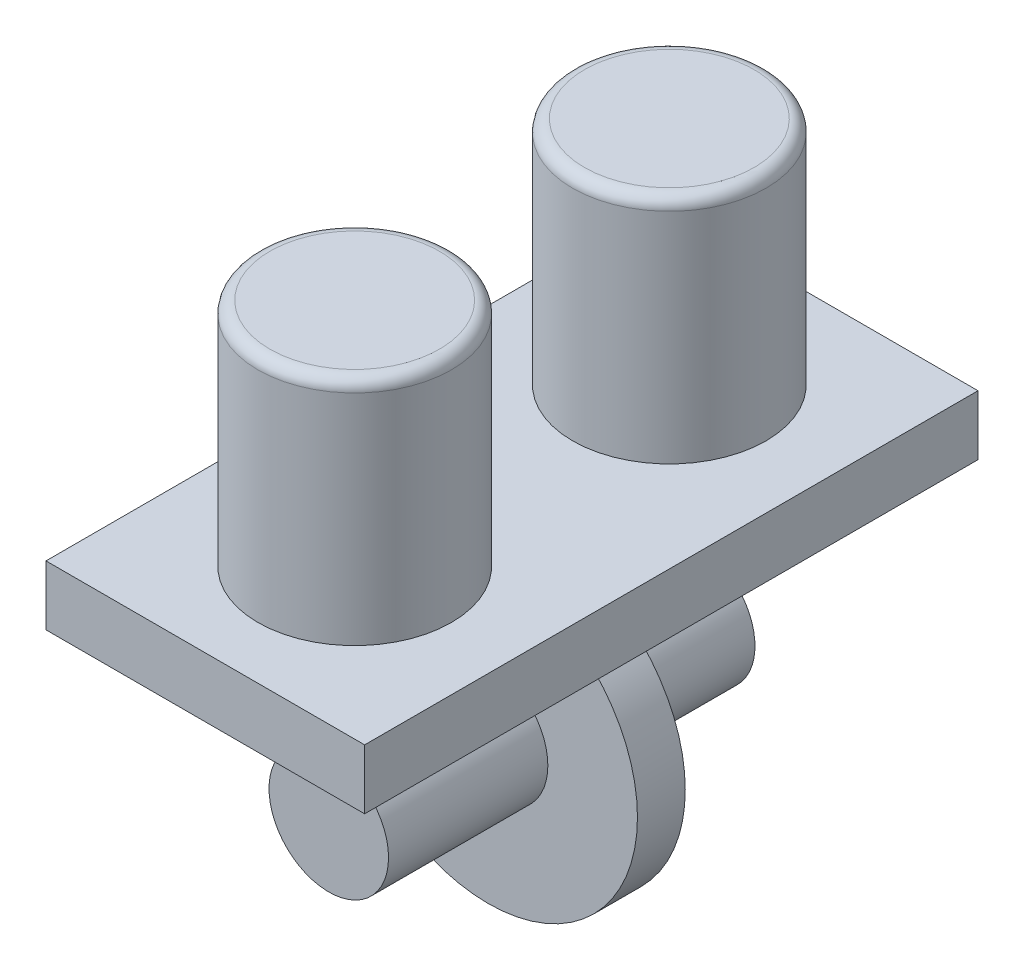
ISO-10303-21;
HEADER;
FILE_DESCRIPTION(('STEP AP214'),'2;1');
FILE_NAME('part.step','',(''),(''),'','','');
FILE_SCHEMA(('AUTOMOTIVE_DESIGN { 1 0 10303 214 1 1 1 1 }'));
ENDSEC;
DATA;
#1=APPLICATION_CONTEXT('core data for automotive mechanical design processes');
#2=APPLICATION_PROTOCOL_DEFINITION('international standard','automotive_design',2000,#1);
#3=PRODUCT_CONTEXT('',#1,'mechanical');
#4=PRODUCT('Part','Part','',(#3));
#5=PRODUCT_RELATED_PRODUCT_CATEGORY('part','',(#4));
#6=PRODUCT_DEFINITION_FORMATION('','',#4);
#7=PRODUCT_DEFINITION_CONTEXT('part definition',#1,'design');
#8=PRODUCT_DEFINITION('design','',#6,#7);
#9=PRODUCT_DEFINITION_SHAPE('','',#8);
#10=(LENGTH_UNIT() NAMED_UNIT(*) SI_UNIT(.MILLI.,.METRE.));
#11=(NAMED_UNIT(*) PLANE_ANGLE_UNIT() SI_UNIT($,.RADIAN.));
#12=(NAMED_UNIT(*) SI_UNIT($,.STERADIAN.) SOLID_ANGLE_UNIT());
#13=UNCERTAINTY_MEASURE_WITH_UNIT(LENGTH_MEASURE(1.E-05),#10,'distance_accuracy_value','');
#14=(GEOMETRIC_REPRESENTATION_CONTEXT(3) GLOBAL_UNCERTAINTY_ASSIGNED_CONTEXT((#13)) GLOBAL_UNIT_ASSIGNED_CONTEXT((#10,
#11,#12)) REPRESENTATION_CONTEXT('',''));
#15=CARTESIAN_POINT('',(0.,0.,0.));
#16=DIRECTION('',(0.,0.,1.));
#17=DIRECTION('',(1.,0.,0.));
#18=AXIS2_PLACEMENT_3D('',#15,#16,#17);
#19=CARTESIAN_POINT('',(0.,0.,30.48));
#20=DIRECTION('',(0.,0.,-1.));
#21=DIRECTION('',(-1.,0.,0.));
#22=AXIS2_PLACEMENT_3D('',#19,#20,#21);
#23=CYLINDRICAL_SURFACE('',#22,95.25);
#24=CARTESIAN_POINT('',(0.,0.,0.));
#25=DIRECTION('',(0.,0.,1.));
#26=DIRECTION('',(1.,0.,0.));
#27=AXIS2_PLACEMENT_3D('',#24,#25,#26);
#28=CIRCLE('',#27,95.25);
#29=CARTESIAN_POINT('',(-95.25,0.,0.));
#30=VERTEX_POINT('',#29);
#31=EDGE_CURVE('E56',#30,#30,#28,.T.);
#32=CARTESIAN_POINT('',(0.,0.,30.48));
#33=DIRECTION('',(0.,0.,1.));
#34=DIRECTION('',(1.,0.,0.));
#35=AXIS2_PLACEMENT_3D('',#32,#33,#34);
#36=CIRCLE('',#35,95.25);
#37=CARTESIAN_POINT('',(-95.25,0.,30.48));
#38=VERTEX_POINT('',#37);
#39=EDGE_CURVE('E47',#38,#38,#36,.T.);
#40=CARTESIAN_POINT('',(-95.25,0.,0.));
#41=CARTESIAN_POINT('',(-95.25,0.,0.317499999999999));
#42=CARTESIAN_POINT('',(-95.25,0.,0.634999999999999));
#43=CARTESIAN_POINT('',(-95.25,0.,1.27));
#44=CARTESIAN_POINT('',(-95.25,0.,1.5875));
#45=CARTESIAN_POINT('',(-95.25,0.,2.2225));
#46=CARTESIAN_POINT('',(-95.25,0.,2.54));
#47=CARTESIAN_POINT('',(-95.25,0.,3.175));
#48=CARTESIAN_POINT('',(-95.25,0.,3.4925));
#49=CARTESIAN_POINT('',(-95.25,0.,4.1275));
#50=CARTESIAN_POINT('',(-95.25,0.,4.445));
#51=CARTESIAN_POINT('',(-95.25,0.,5.08));
#52=CARTESIAN_POINT('',(-95.25,0.,5.3975));
#53=CARTESIAN_POINT('',(-95.25,0.,6.0325));
#54=CARTESIAN_POINT('',(-95.25,0.,6.35));
#55=CARTESIAN_POINT('',(-95.25,0.,6.985));
#56=CARTESIAN_POINT('',(-95.25,0.,7.3025));
#57=CARTESIAN_POINT('',(-95.25,0.,7.9375));
#58=CARTESIAN_POINT('',(-95.25,0.,8.255));
#59=CARTESIAN_POINT('',(-95.25,0.,8.89));
#60=CARTESIAN_POINT('',(-95.25,0.,9.2075));
#61=CARTESIAN_POINT('',(-95.25,0.,9.8425));
#62=CARTESIAN_POINT('',(-95.25,0.,10.16));
#63=CARTESIAN_POINT('',(-95.25,0.,10.795));
#64=CARTESIAN_POINT('',(-95.25,0.,11.1125));
#65=CARTESIAN_POINT('',(-95.25,0.,11.7475));
#66=CARTESIAN_POINT('',(-95.25,0.,12.065));
#67=CARTESIAN_POINT('',(-95.25,0.,12.7));
#68=CARTESIAN_POINT('',(-95.25,0.,13.0175));
#69=CARTESIAN_POINT('',(-95.25,0.,13.6525));
#70=CARTESIAN_POINT('',(-95.25,0.,13.97));
#71=CARTESIAN_POINT('',(-95.25,0.,14.605));
#72=CARTESIAN_POINT('',(-95.25,0.,14.9225));
#73=CARTESIAN_POINT('',(-95.25,0.,15.5575));
#74=CARTESIAN_POINT('',(-95.25,0.,15.875));
#75=CARTESIAN_POINT('',(-95.25,0.,16.51));
#76=CARTESIAN_POINT('',(-95.25,0.,16.8275));
#77=CARTESIAN_POINT('',(-95.25,0.,17.4625));
#78=CARTESIAN_POINT('',(-95.25,0.,17.78));
#79=CARTESIAN_POINT('',(-95.25,0.,18.415));
#80=CARTESIAN_POINT('',(-95.25,0.,18.7325));
#81=CARTESIAN_POINT('',(-95.25,0.,19.3675));
#82=CARTESIAN_POINT('',(-95.25,0.,19.685));
#83=CARTESIAN_POINT('',(-95.25,0.,20.32));
#84=CARTESIAN_POINT('',(-95.25,0.,20.6375));
#85=CARTESIAN_POINT('',(-95.25,0.,21.2725));
#86=CARTESIAN_POINT('',(-95.25,0.,21.59));
#87=CARTESIAN_POINT('',(-95.25,0.,22.225));
#88=CARTESIAN_POINT('',(-95.25,0.,22.5425));
#89=CARTESIAN_POINT('',(-95.25,0.,23.1775));
#90=CARTESIAN_POINT('',(-95.25,0.,23.495));
#91=CARTESIAN_POINT('',(-95.25,0.,24.13));
#92=CARTESIAN_POINT('',(-95.25,0.,24.4475));
#93=CARTESIAN_POINT('',(-95.25,0.,25.0825));
#94=CARTESIAN_POINT('',(-95.25,0.,25.4));
#95=CARTESIAN_POINT('',(-95.25,0.,26.035));
#96=CARTESIAN_POINT('',(-95.25,0.,26.3525));
#97=CARTESIAN_POINT('',(-95.25,0.,26.9875));
#98=CARTESIAN_POINT('',(-95.25,0.,27.305));
#99=CARTESIAN_POINT('',(-95.25,0.,27.94));
#100=CARTESIAN_POINT('',(-95.25,0.,28.2575));
#101=CARTESIAN_POINT('',(-95.25,0.,28.8925));
#102=CARTESIAN_POINT('',(-95.25,0.,29.21));
#103=CARTESIAN_POINT('',(-95.25,0.,29.845));
#104=CARTESIAN_POINT('',(-95.25,0.,30.1625));
#105=CARTESIAN_POINT('',(-95.25,0.,30.48));
#106=B_SPLINE_CURVE_WITH_KNOTS('',3,(#40,#41,#42,#43,#44,#45,#46,#47,#48,#49,#50,#51,#52,#53,
#54,#55,#56,#57,#58,#59,#60,#61,#62,#63,#64,#65,#66,#67,#68,#69,#70,#71,#72,#73,#74,#75,#76,#77,
#78,#79,#80,#81,#82,#83,#84,#85,#86,#87,#88,#89,#90,#91,#92,#93,#94,#95,#96,#97,#98,#99,#100,
#101,#102,#103,#104,#105),.UNSPECIFIED.,.F.,.F.,(4,2,2,2,2,2,2,2,2,2,2,2,2,2,2,2,2,2,2,2,2,2,2,
2,2,2,2,2,2,2,2,2,4),(0.,0.952499999999998,1.905,2.8575,3.81,4.7625,5.715,6.6675,7.62,8.5725,
9.525,10.4775,11.43,12.3825,13.335,14.2875,15.24,16.1925,17.145,18.0975,19.05,20.0025,20.955,
21.9075,22.86,23.8125,24.765,25.7175,26.67,27.6225,28.575,29.5275,30.48),.UNSPECIFIED.);
#107=EDGE_CURVE('BSEAM43',#30,#38,#106,.T.);
#108=ORIENTED_EDGE('',*,*,#31,.T.);
#109=ORIENTED_EDGE('',*,*,#39,.F.);
#110=ORIENTED_EDGE('',*,*,#107,.T.);
#111=ORIENTED_EDGE('',*,*,#107,.F.);
#112=EDGE_LOOP('',(#108,#110,#109,#111));
#113=FACE_BOUND('',#112,.T.);
#114=ADVANCED_FACE('F43',(#113),#23,.T.);
#115=CARTESIAN_POINT('',(0.,0.,30.48));
#116=DIRECTION('',(0.,0.,1.));
#117=DIRECTION('',(1.,0.,0.));
#118=AXIS2_PLACEMENT_3D('',#115,#116,#117);
#119=PLANE('',#118);
#120=CARTESIAN_POINT('',(0.,0.,30.48));
#121=DIRECTION('',(0.,0.,1.));
#122=DIRECTION('',(1.,0.,0.));
#123=AXIS2_PLACEMENT_3D('',#120,#121,#122);
#124=CIRCLE('',#123,38.1);
#125=CARTESIAN_POINT('',(38.1,0.,30.48));
#126=VERTEX_POINT('',#125);
#127=EDGE_CURVE('E51',#126,#126,#124,.T.);
#128=ORIENTED_EDGE('',*,*,#127,.F.);
#129=EDGE_LOOP('',(#128));
#130=FACE_BOUND('',#129,.T.);
#131=ORIENTED_EDGE('',*,*,#39,.T.);
#132=EDGE_LOOP('',(#131));
#133=FACE_BOUND('',#132,.T.);
#134=ADVANCED_FACE('F45',(#130,#133),#119,.T.);
#135=CARTESIAN_POINT('',(0.,0.,0.));
#136=DIRECTION('',(0.,0.,1.));
#137=DIRECTION('',(1.,0.,0.));
#138=AXIS2_PLACEMENT_3D('',#135,#136,#137);
#139=PLANE('',#138);
#140=CARTESIAN_POINT('',(0.,0.,0.));
#141=DIRECTION('',(0.,0.,-1.));
#142=DIRECTION('',(-1.,0.,0.));
#143=AXIS2_PLACEMENT_3D('',#140,#141,#142);
#144=CIRCLE('',#143,38.1);
#145=CARTESIAN_POINT('',(-38.1,0.,0.));
#146=VERTEX_POINT('',#145);
#147=EDGE_CURVE('E11',#146,#146,#144,.T.);
#148=ORIENTED_EDGE('',*,*,#147,.F.);
#149=EDGE_LOOP('',(#148));
#150=FACE_BOUND('',#149,.T.);
#151=ORIENTED_EDGE('',*,*,#31,.F.);
#152=EDGE_LOOP('',(#151));
#153=FACE_BOUND('',#152,.T.);
#154=ADVANCED_FACE('F75',(#150,#153),#139,.F.);
#155=CARTESIAN_POINT('',(0.,0.,132.08));
#156=DIRECTION('',(0.,0.,-1.));
#157=DIRECTION('',(-1.,0.,0.));
#158=AXIS2_PLACEMENT_3D('',#155,#156,#157);
#159=CYLINDRICAL_SURFACE('',#158,38.1);
#160=CARTESIAN_POINT('',(0.,0.,132.08));
#161=DIRECTION('',(0.,0.,1.));
#162=DIRECTION('',(1.,0.,0.));
#163=AXIS2_PLACEMENT_3D('',#160,#161,#162);
#164=CIRCLE('',#163,38.1);
#165=CARTESIAN_POINT('',(38.1,0.,132.08));
#166=VERTEX_POINT('',#165);
#167=EDGE_CURVE('E61',#166,#166,#164,.T.);
#168=ORIENTED_EDGE('',*,*,#167,.F.);
#169=EDGE_LOOP('',(#168));
#170=FACE_BOUND('',#169,.T.);
#171=ORIENTED_EDGE('',*,*,#127,.T.);
#172=EDGE_LOOP('',(#171));
#173=FACE_BOUND('',#172,.T.);
#174=ADVANCED_FACE('F78',(#170,#173),#159,.T.);
#175=CARTESIAN_POINT('',(0.,0.,132.08));
#176=DIRECTION('',(0.,0.,1.));
#177=DIRECTION('',(1.,0.,0.));
#178=AXIS2_PLACEMENT_3D('',#175,#176,#177);
#179=PLANE('',#178);
#180=ORIENTED_EDGE('',*,*,#167,.T.);
#181=EDGE_LOOP('',(#180));
#182=FACE_BOUND('',#181,.T.);
#183=ADVANCED_FACE('F85',(#182),#179,.T.);
#184=CARTESIAN_POINT('',(0.,0.,-101.6));
#185=DIRECTION('',(0.,0.,1.));
#186=DIRECTION('',(1.,0.,0.));
#187=AXIS2_PLACEMENT_3D('',#184,#185,#186);
#188=CYLINDRICAL_SURFACE('',#187,38.1);
#189=CARTESIAN_POINT('',(0.,0.,-101.6));
#190=DIRECTION('',(0.,0.,-1.));
#191=DIRECTION('',(-1.,0.,0.));
#192=AXIS2_PLACEMENT_3D('',#189,#190,#191);
#193=CIRCLE('',#192,38.1);
#194=CARTESIAN_POINT('',(-38.1,0.,-101.6));
#195=VERTEX_POINT('',#194);
#196=EDGE_CURVE('E60',#195,#195,#193,.T.);
#197=ORIENTED_EDGE('',*,*,#196,.F.);
#198=EDGE_LOOP('',(#197));
#199=FACE_BOUND('',#198,.T.);
#200=ORIENTED_EDGE('',*,*,#147,.T.);
#201=EDGE_LOOP('',(#200));
#202=FACE_BOUND('',#201,.T.);
#203=ADVANCED_FACE('F91',(#199,#202),#188,.T.);
#204=CARTESIAN_POINT('',(0.,0.,-101.6));
#205=DIRECTION('',(0.,0.,-1.));
#206=DIRECTION('',(-1.,0.,0.));
#207=AXIS2_PLACEMENT_3D('',#204,#205,#206);
#208=PLANE('',#207);
#209=ORIENTED_EDGE('',*,*,#196,.T.);
#210=EDGE_LOOP('',(#209));
#211=FACE_BOUND('',#210,.T.);
#212=ADVANCED_FACE('F99',(#211),#208,.T.);
#213=CLOSED_SHELL('',(#114,#134,#154,#174,#183,#203,#212));
#214=MANIFOLD_SOLID_BREP('B2',#213);
#215=CARTESIAN_POINT('',(-101.6,95.25,30.48));
#216=DIRECTION('',(0.,1.,0.));
#217=DIRECTION('',(0.,0.,1.));
#218=AXIS2_PLACEMENT_3D('',#215,#216,#217);
#219=PLANE('',#218);
#220=DIRECTION('',(0.,0.,-1.));
#221=VECTOR('',#220,1.);
#222=CARTESIAN_POINT('',(101.6,95.25,30.48));
#223=LINE('',#222,#221);
#224=CARTESIAN_POINT('',(101.6,95.25,210.82));
#225=VERTEX_POINT('',#224);
#226=CARTESIAN_POINT('',(101.6,95.25,-180.34));
#227=VERTEX_POINT('',#226);
#228=EDGE_CURVE('E197',#225,#227,#223,.T.);
#229=ORIENTED_EDGE('',*,*,#228,.F.);
#230=DIRECTION('',(1.,0.,0.));
#231=VECTOR('',#230,1.);
#232=CARTESIAN_POINT('',(-101.6,95.25,210.82));
#233=LINE('',#232,#231);
#234=CARTESIAN_POINT('',(-101.6,95.25,210.82));
#235=VERTEX_POINT('',#234);
#236=EDGE_CURVE('E196',#235,#225,#233,.T.);
#237=ORIENTED_EDGE('',*,*,#236,.F.);
#238=DIRECTION('',(0.,0.,-1.));
#239=VECTOR('',#238,1.);
#240=CARTESIAN_POINT('',(-101.6,95.25,30.48));
#241=LINE('',#240,#239);
#242=CARTESIAN_POINT('',(-101.6,95.25,-180.34));
#243=VERTEX_POINT('',#242);
#244=EDGE_CURVE('E184',#235,#243,#241,.T.);
#245=ORIENTED_EDGE('',*,*,#244,.T.);
#246=DIRECTION('',(-1.,0.,0.));
#247=VECTOR('',#246,1.);
#248=CARTESIAN_POINT('',(101.6,95.25,-180.34));
#249=LINE('',#248,#247);
#250=EDGE_CURVE('E218',#227,#243,#249,.T.);
#251=ORIENTED_EDGE('',*,*,#250,.F.);
#252=EDGE_LOOP('',(#229,#237,#245,#251));
#253=FACE_BOUND('',#252,.T.);
#254=ADVANCED_FACE('F144',(#253),#219,.F.);
#255=CARTESIAN_POINT('',(101.6,133.35,30.48));
#256=DIRECTION('',(1.,0.,0.));
#257=DIRECTION('',(0.,0.,-1.));
#258=AXIS2_PLACEMENT_3D('',#255,#256,#257);
#259=PLANE('',#258);
#260=ORIENTED_EDGE('',*,*,#228,.T.);
#261=DIRECTION('',(0.,-1.,0.));
#262=VECTOR('',#261,1.);
#263=CARTESIAN_POINT('',(101.6,133.35,-180.34));
#264=LINE('',#263,#262);
#265=CARTESIAN_POINT('',(101.6,133.35,-180.34));
#266=VERTEX_POINT('',#265);
#267=EDGE_CURVE('E215',#266,#227,#264,.T.);
#268=ORIENTED_EDGE('',*,*,#267,.F.);
#269=DIRECTION('',(0.,0.,-1.));
#270=VECTOR('',#269,1.);
#271=CARTESIAN_POINT('',(101.6,133.35,30.48));
#272=LINE('',#271,#270);
#273=CARTESIAN_POINT('',(101.6,133.35,210.82));
#274=VERTEX_POINT('',#273);
#275=EDGE_CURVE('E159',#274,#266,#272,.T.);
#276=ORIENTED_EDGE('',*,*,#275,.F.);
#277=DIRECTION('',(0.,1.,0.));
#278=VECTOR('',#277,1.);
#279=CARTESIAN_POINT('',(101.6,133.35,210.82));
#280=LINE('',#279,#278);
#281=EDGE_CURVE('E201',#225,#274,#280,.T.);
#282=ORIENTED_EDGE('',*,*,#281,.F.);
#283=EDGE_LOOP('',(#260,#268,#276,#282));
#284=FACE_BOUND('',#283,.T.);
#285=ADVANCED_FACE('F253',(#284),#259,.T.);
#286=CARTESIAN_POINT('',(-101.6,133.35,30.48));
#287=DIRECTION('',(0.,1.,0.));
#288=DIRECTION('',(0.,0.,1.));
#289=AXIS2_PLACEMENT_3D('',#286,#287,#288);
#290=PLANE('',#289);
#291=CARTESIAN_POINT('',(-7.00600645452263E-13,133.35,-85.09));
#292=DIRECTION('',(0.,1.,0.));
#293=DIRECTION('',(0.,0.,1.));
#294=AXIS2_PLACEMENT_3D('',#291,#292,#293);
#295=CIRCLE('',#294,61.722);
#296=CARTESIAN_POINT('',(-7.00600645452263E-13,133.35,-23.368));
#297=VERTEX_POINT('',#296);
#298=EDGE_CURVE('E209',#297,#297,#295,.T.);
#299=ORIENTED_EDGE('',*,*,#298,.F.);
#300=EDGE_LOOP('',(#299));
#301=FACE_BOUND('',#300,.T.);
#302=CARTESIAN_POINT('',(0.,133.35,115.57));
#303=DIRECTION('',(0.,1.,0.));
#304=DIRECTION('',(0.,0.,1.));
#305=AXIS2_PLACEMENT_3D('',#302,#303,#304);
#306=CIRCLE('',#305,61.722);
#307=CARTESIAN_POINT('',(0.,133.35,177.292));
#308=VERTEX_POINT('',#307);
#309=EDGE_CURVE('E206',#308,#308,#306,.T.);
#310=ORIENTED_EDGE('',*,*,#309,.F.);
#311=EDGE_LOOP('',(#310));
#312=FACE_BOUND('',#311,.T.);
#313=ORIENTED_EDGE('',*,*,#275,.T.);
#314=DIRECTION('',(1.,0.,0.));
#315=VECTOR('',#314,1.);
#316=CARTESIAN_POINT('',(101.6,133.35,-180.34));
#317=LINE('',#316,#315);
#318=CARTESIAN_POINT('',(-101.6,133.35,-180.34));
#319=VERTEX_POINT('',#318);
#320=EDGE_CURVE('E193',#319,#266,#317,.T.);
#321=ORIENTED_EDGE('',*,*,#320,.F.);
#322=DIRECTION('',(0.,0.,-1.));
#323=VECTOR('',#322,1.);
#324=CARTESIAN_POINT('',(-101.6,133.35,30.48));
#325=LINE('',#324,#323);
#326=CARTESIAN_POINT('',(-101.6,133.35,210.82));
#327=VERTEX_POINT('',#326);
#328=EDGE_CURVE('E167',#327,#319,#325,.T.);
#329=ORIENTED_EDGE('',*,*,#328,.F.);
#330=DIRECTION('',(-1.,0.,0.));
#331=VECTOR('',#330,1.);
#332=CARTESIAN_POINT('',(-101.6,133.35,210.82));
#333=LINE('',#332,#331);
#334=EDGE_CURVE('E205',#274,#327,#333,.T.);
#335=ORIENTED_EDGE('',*,*,#334,.F.);
#336=EDGE_LOOP('',(#313,#321,#329,#335));
#337=FACE_BOUND('',#336,.T.);
#338=ADVANCED_FACE('F245',(#301,#312,#337),#290,.T.);
#339=CARTESIAN_POINT('',(-101.6,133.35,30.48));
#340=DIRECTION('',(1.,0.,0.));
#341=DIRECTION('',(0.,0.,-1.));
#342=AXIS2_PLACEMENT_3D('',#339,#340,#341);
#343=PLANE('',#342);
#344=ORIENTED_EDGE('',*,*,#328,.T.);
#345=DIRECTION('',(0.,1.,0.));
#346=VECTOR('',#345,1.);
#347=CARTESIAN_POINT('',(-101.6,133.35,-180.34));
#348=LINE('',#347,#346);
#349=EDGE_CURVE('E189',#243,#319,#348,.T.);
#350=ORIENTED_EDGE('',*,*,#349,.F.);
#351=ORIENTED_EDGE('',*,*,#244,.F.);
#352=DIRECTION('',(0.,-1.,0.));
#353=VECTOR('',#352,1.);
#354=CARTESIAN_POINT('',(-101.6,133.35,210.82));
#355=LINE('',#354,#353);
#356=EDGE_CURVE('E188',#327,#235,#355,.T.);
#357=ORIENTED_EDGE('',*,*,#356,.F.);
#358=EDGE_LOOP('',(#344,#350,#351,#357));
#359=FACE_BOUND('',#358,.T.);
#360=ADVANCED_FACE('F186',(#359),#343,.F.);
#361=CARTESIAN_POINT('',(0.,0.,-180.34));
#362=DIRECTION('',(0.,0.,-1.));
#363=DIRECTION('',(-1.,0.,0.));
#364=AXIS2_PLACEMENT_3D('',#361,#362,#363);
#365=PLANE('',#364);
#366=ORIENTED_EDGE('',*,*,#267,.T.);
#367=ORIENTED_EDGE('',*,*,#250,.T.);
#368=ORIENTED_EDGE('',*,*,#349,.T.);
#369=ORIENTED_EDGE('',*,*,#320,.T.);
#370=EDGE_LOOP('',(#366,#367,#368,#369));
#371=FACE_BOUND('',#370,.T.);
#372=ADVANCED_FACE('F244',(#371),#365,.T.);
#373=CARTESIAN_POINT('',(0.,0.,210.82));
#374=DIRECTION('',(0.,0.,1.));
#375=DIRECTION('',(1.,0.,0.));
#376=AXIS2_PLACEMENT_3D('',#373,#374,#375);
#377=PLANE('',#376);
#378=ORIENTED_EDGE('',*,*,#356,.T.);
#379=ORIENTED_EDGE('',*,*,#236,.T.);
#380=ORIENTED_EDGE('',*,*,#281,.T.);
#381=ORIENTED_EDGE('',*,*,#334,.T.);
#382=EDGE_LOOP('',(#378,#379,#380,#381));
#383=FACE_BOUND('',#382,.T.);
#384=ADVANCED_FACE('F204',(#383),#377,.T.);
#385=CARTESIAN_POINT('',(0.,280.4922,115.57));
#386=DIRECTION('',(0.,-1.,0.));
#387=DIRECTION('',(0.,0.,-1.));
#388=AXIS2_PLACEMENT_3D('',#385,#386,#387);
#389=CYLINDRICAL_SURFACE('',#388,61.722);
#390=CARTESIAN_POINT('',(0.,272.8722,115.57));
#391=DIRECTION('',(0.,1.,0.));
#392=DIRECTION('',(0.,0.,1.));
#393=AXIS2_PLACEMENT_3D('',#390,#391,#392);
#394=CIRCLE('',#393,61.722);
#395=CARTESIAN_POINT('',(0.,272.8722,177.292));
#396=VERTEX_POINT('',#395);
#397=EDGE_CURVE('E228',#396,#396,#394,.F.);
#398=ORIENTED_EDGE('',*,*,#397,.T.);
#399=EDGE_LOOP('',(#398));
#400=FACE_BOUND('',#399,.T.);
#401=ORIENTED_EDGE('',*,*,#309,.T.);
#402=EDGE_LOOP('',(#401));
#403=FACE_BOUND('',#402,.T.);
#404=ADVANCED_FACE('F284',(#400,#403),#389,.T.);
#405=CARTESIAN_POINT('',(0.,280.4922,115.57));
#406=DIRECTION('',(0.,1.,0.));
#407=DIRECTION('',(0.,0.,1.));
#408=AXIS2_PLACEMENT_3D('',#405,#406,#407);
#409=PLANE('',#408);
#410=CARTESIAN_POINT('',(0.,280.4922,115.57));
#411=DIRECTION('',(0.,1.,0.));
#412=DIRECTION('',(0.,0.,1.));
#413=AXIS2_PLACEMENT_3D('',#410,#411,#412);
#414=CIRCLE('',#413,54.102);
#415=CARTESIAN_POINT('',(0.,280.4922,169.672));
#416=VERTEX_POINT('',#415);
#417=EDGE_CURVE('E225',#416,#416,#414,.T.);
#418=ORIENTED_EDGE('',*,*,#417,.T.);
#419=EDGE_LOOP('',(#418));
#420=FACE_BOUND('',#419,.T.);
#421=ADVANCED_FACE('F289',(#420),#409,.T.);
#422=CARTESIAN_POINT('',(-7.00600645452263E-13,280.4922,-85.09));
#423=DIRECTION('',(0.,-1.,0.));
#424=DIRECTION('',(0.,0.,-1.));
#425=AXIS2_PLACEMENT_3D('',#422,#423,#424);
#426=CYLINDRICAL_SURFACE('',#425,61.722);
#427=CARTESIAN_POINT('',(-7.00600645452263E-13,272.8722,-85.09));
#428=DIRECTION('',(0.,1.,0.));
#429=DIRECTION('',(0.,0.,1.));
#430=AXIS2_PLACEMENT_3D('',#427,#428,#429);
#431=CIRCLE('',#430,61.722);
#432=CARTESIAN_POINT('',(-7.00600645452263E-13,272.8722,-23.368));
#433=VERTEX_POINT('',#432);
#434=EDGE_CURVE('E41',#433,#433,#431,.F.);
#435=ORIENTED_EDGE('',*,*,#434,.T.);
#436=EDGE_LOOP('',(#435));
#437=FACE_BOUND('',#436,.T.);
#438=ORIENTED_EDGE('',*,*,#298,.T.);
#439=EDGE_LOOP('',(#438));
#440=FACE_BOUND('',#439,.T.);
#441=ADVANCED_FACE('F299',(#437,#440),#426,.T.);
#442=CARTESIAN_POINT('',(-7.00600645452263E-13,280.4922,-85.09));
#443=DIRECTION('',(0.,1.,0.));
#444=DIRECTION('',(0.,0.,1.));
#445=AXIS2_PLACEMENT_3D('',#442,#443,#444);
#446=PLANE('',#445);
#447=CARTESIAN_POINT('',(-7.00600645452263E-13,280.4922,-85.09));
#448=DIRECTION('',(0.,1.,0.));
#449=DIRECTION('',(0.,0.,1.));
#450=AXIS2_PLACEMENT_3D('',#447,#448,#449);
#451=CIRCLE('',#450,54.102);
#452=CARTESIAN_POINT('',(-7.00600645452263E-13,280.4922,-30.988));
#453=VERTEX_POINT('',#452);
#454=EDGE_CURVE('E152',#453,#453,#451,.T.);
#455=ORIENTED_EDGE('',*,*,#454,.T.);
#456=EDGE_LOOP('',(#455));
#457=FACE_BOUND('',#456,.T.);
#458=ADVANCED_FACE('F233',(#457),#446,.T.);
#459=CARTESIAN_POINT('',(0.,272.8722,115.57));
#460=DIRECTION('',(0.,1.,0.));
#461=DIRECTION('',(0.,0.,1.));
#462=AXIS2_PLACEMENT_3D('',#459,#460,#461);
#463=TOROIDAL_SURFACE('',#462,54.102,7.62);
#464=ORIENTED_EDGE('',*,*,#397,.F.);
#465=EDGE_LOOP('',(#464));
#466=FACE_BOUND('',#465,.T.);
#467=ORIENTED_EDGE('',*,*,#417,.F.);
#468=EDGE_LOOP('',(#467));
#469=FACE_BOUND('',#468,.T.);
#470=ADVANCED_FACE('F236',(#466,#469),#463,.T.);
#471=CARTESIAN_POINT('',(-7.00600645452263E-13,272.8722,-85.09));
#472=DIRECTION('',(0.,1.,0.));
#473=DIRECTION('',(0.,0.,1.));
#474=AXIS2_PLACEMENT_3D('',#471,#472,#473);
#475=TOROIDAL_SURFACE('',#474,54.102,7.62);
#476=ORIENTED_EDGE('',*,*,#434,.F.);
#477=EDGE_LOOP('',(#476));
#478=FACE_BOUND('',#477,.T.);
#479=ORIENTED_EDGE('',*,*,#454,.F.);
#480=EDGE_LOOP('',(#479));
#481=FACE_BOUND('',#480,.T.);
#482=ADVANCED_FACE('F146',(#478,#481),#475,.T.);
#483=CLOSED_SHELL('',(#254,#285,#338,#360,#372,#384,#404,#421,#441,#458,#470,#482));
#484=MANIFOLD_SOLID_BREP('B6',#483);
#485=ADVANCED_BREP_SHAPE_REPRESENTATION('',(#18,#214,#484),#14);
#486=SHAPE_DEFINITION_REPRESENTATION(#9,#485);
ENDSEC;
END-ISO-10303-21;
